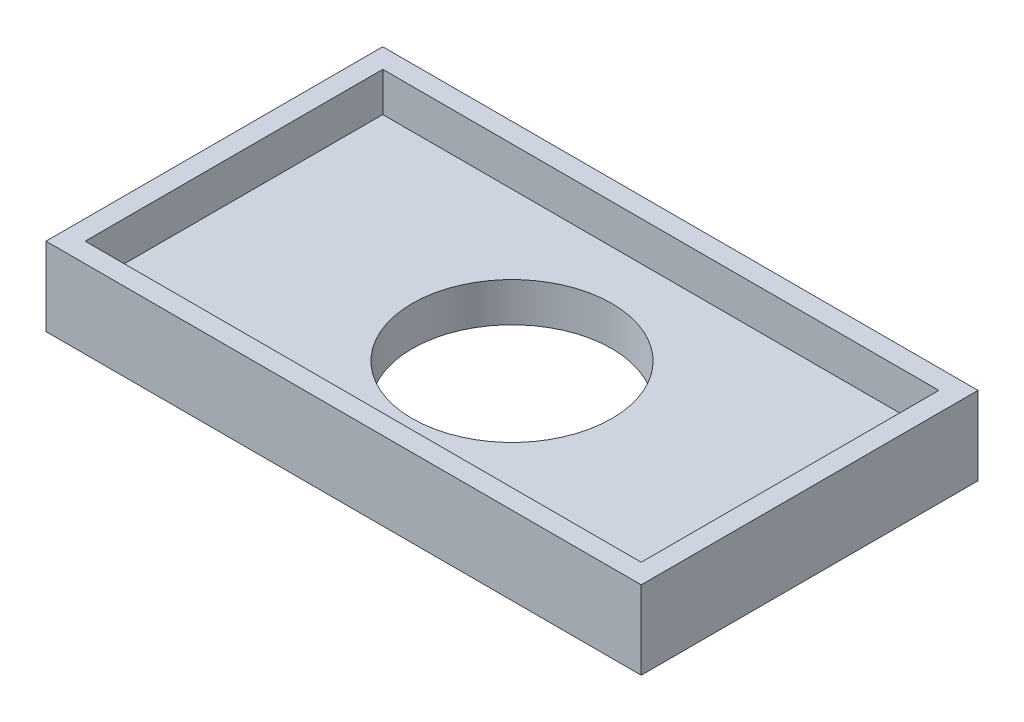
ISO-10303-21;
HEADER;
FILE_DESCRIPTION(('STEP AP214'),'2;1');
FILE_NAME('part.step','',(''),(''),'','','');
FILE_SCHEMA(('AUTOMOTIVE_DESIGN { 1 0 10303 214 1 1 1 1 }'));
ENDSEC;
DATA;
#1=APPLICATION_CONTEXT('core data for automotive mechanical design processes');
#2=APPLICATION_PROTOCOL_DEFINITION('international standard','automotive_design',2000,#1);
#3=PRODUCT_CONTEXT('',#1,'mechanical');
#4=PRODUCT('Part','Part','',(#3));
#5=PRODUCT_RELATED_PRODUCT_CATEGORY('part','',(#4));
#6=PRODUCT_DEFINITION_FORMATION('','',#4);
#7=PRODUCT_DEFINITION_CONTEXT('part definition',#1,'design');
#8=PRODUCT_DEFINITION('design','',#6,#7);
#9=PRODUCT_DEFINITION_SHAPE('','',#8);
#10=(LENGTH_UNIT() NAMED_UNIT(*) SI_UNIT(.MILLI.,.METRE.));
#11=(NAMED_UNIT(*) PLANE_ANGLE_UNIT() SI_UNIT($,.RADIAN.));
#12=(NAMED_UNIT(*) SI_UNIT($,.STERADIAN.) SOLID_ANGLE_UNIT());
#13=UNCERTAINTY_MEASURE_WITH_UNIT(LENGTH_MEASURE(1.E-05),#10,'distance_accuracy_value','');
#14=(GEOMETRIC_REPRESENTATION_CONTEXT(3) GLOBAL_UNCERTAINTY_ASSIGNED_CONTEXT((#13)) GLOBAL_UNIT_ASSIGNED_CONTEXT((#10,
#11,#12)) REPRESENTATION_CONTEXT('',''));
#15=CARTESIAN_POINT('',(0.,0.,0.));
#16=DIRECTION('',(0.,0.,1.));
#17=DIRECTION('',(1.,0.,0.));
#18=AXIS2_PLACEMENT_3D('',#15,#16,#17);
#19=CARTESIAN_POINT('',(76.,10.,-43.));
#20=DIRECTION('',(-1.,0.,0.));
#21=DIRECTION('',(0.,0.,1.));
#22=AXIS2_PLACEMENT_3D('',#19,#20,#21);
#23=PLANE('',#22);
#24=DIRECTION('',(0.,0.,-1.));
#25=VECTOR('',#24,1.);
#26=CARTESIAN_POINT('',(76.,0.,-43.));
#27=LINE('',#26,#25);
#28=CARTESIAN_POINT('',(76.,0.,43.));
#29=VERTEX_POINT('',#28);
#30=CARTESIAN_POINT('',(76.,0.,-43.));
#31=VERTEX_POINT('',#30);
#32=EDGE_CURVE('E150',#29,#31,#27,.T.);
#33=ORIENTED_EDGE('',*,*,#32,.T.);
#34=DIRECTION('',(0.,-1.,0.));
#35=VECTOR('',#34,1.);
#36=CARTESIAN_POINT('',(76.,10.,-43.));
#37=LINE('',#36,#35);
#38=CARTESIAN_POINT('',(76.,20.,-43.));
#39=VERTEX_POINT('',#38);
#40=EDGE_CURVE('E11',#39,#31,#37,.T.);
#41=ORIENTED_EDGE('',*,*,#40,.F.);
#42=DIRECTION('',(0.,0.,-1.));
#43=VECTOR('',#42,1.);
#44=CARTESIAN_POINT('',(76.,20.,-43.));
#45=LINE('',#44,#43);
#46=CARTESIAN_POINT('',(76.,20.,43.));
#47=VERTEX_POINT('',#46);
#48=EDGE_CURVE('E116',#47,#39,#45,.T.);
#49=ORIENTED_EDGE('',*,*,#48,.F.);
#50=DIRECTION('',(0.,-1.,0.));
#51=VECTOR('',#50,1.);
#52=CARTESIAN_POINT('',(76.,10.,43.));
#53=LINE('',#52,#51);
#54=EDGE_CURVE('E159',#47,#29,#53,.T.);
#55=ORIENTED_EDGE('',*,*,#54,.T.);
#56=EDGE_LOOP('',(#33,#41,#49,#55));
#57=FACE_BOUND('',#56,.T.);
#58=ADVANCED_FACE('F37',(#57),#23,.F.);
#59=CARTESIAN_POINT('',(-76.,10.,-43.));
#60=DIRECTION('',(0.,0.,1.));
#61=DIRECTION('',(1.,0.,0.));
#62=AXIS2_PLACEMENT_3D('',#59,#60,#61);
#63=PLANE('',#62);
#64=DIRECTION('',(-1.,0.,0.));
#65=VECTOR('',#64,1.);
#66=CARTESIAN_POINT('',(-76.,0.,-43.));
#67=LINE('',#66,#65);
#68=CARTESIAN_POINT('',(-76.,0.,-43.));
#69=VERTEX_POINT('',#68);
#70=EDGE_CURVE('E153',#31,#69,#67,.T.);
#71=ORIENTED_EDGE('',*,*,#70,.T.);
#72=DIRECTION('',(0.,-1.,0.));
#73=VECTOR('',#72,1.);
#74=CARTESIAN_POINT('',(-76.,10.,-43.));
#75=LINE('',#74,#73);
#76=CARTESIAN_POINT('',(-76.,20.,-43.));
#77=VERTEX_POINT('',#76);
#78=EDGE_CURVE('E45',#77,#69,#75,.T.);
#79=ORIENTED_EDGE('',*,*,#78,.F.);
#80=DIRECTION('',(-1.,0.,0.));
#81=VECTOR('',#80,1.);
#82=CARTESIAN_POINT('',(-76.,20.,-43.));
#83=LINE('',#82,#81);
#84=EDGE_CURVE('E141',#39,#77,#83,.T.);
#85=ORIENTED_EDGE('',*,*,#84,.F.);
#86=ORIENTED_EDGE('',*,*,#40,.T.);
#87=EDGE_LOOP('',(#71,#79,#85,#86));
#88=FACE_BOUND('',#87,.T.);
#89=ADVANCED_FACE('F182',(#88),#63,.F.);
#90=CARTESIAN_POINT('',(-76.,10.,-43.));
#91=DIRECTION('',(1.,0.,0.));
#92=DIRECTION('',(0.,0.,-1.));
#93=AXIS2_PLACEMENT_3D('',#90,#91,#92);
#94=PLANE('',#93);
#95=DIRECTION('',(0.,0.,1.));
#96=VECTOR('',#95,1.);
#97=CARTESIAN_POINT('',(-76.,0.,-43.));
#98=LINE('',#97,#96);
#99=CARTESIAN_POINT('',(-76.,0.,43.));
#100=VERTEX_POINT('',#99);
#101=EDGE_CURVE('E155',#69,#100,#98,.T.);
#102=ORIENTED_EDGE('',*,*,#101,.T.);
#103=DIRECTION('',(0.,-1.,0.));
#104=VECTOR('',#103,1.);
#105=CARTESIAN_POINT('',(-76.,10.,43.));
#106=LINE('',#105,#104);
#107=CARTESIAN_POINT('',(-76.,20.,43.));
#108=VERTEX_POINT('',#107);
#109=EDGE_CURVE('E162',#108,#100,#106,.T.);
#110=ORIENTED_EDGE('',*,*,#109,.F.);
#111=DIRECTION('',(0.,0.,1.));
#112=VECTOR('',#111,1.);
#113=CARTESIAN_POINT('',(-76.,20.,-43.));
#114=LINE('',#113,#112);
#115=EDGE_CURVE('E144',#77,#108,#114,.T.);
#116=ORIENTED_EDGE('',*,*,#115,.F.);
#117=ORIENTED_EDGE('',*,*,#78,.T.);
#118=EDGE_LOOP('',(#102,#110,#116,#117));
#119=FACE_BOUND('',#118,.T.);
#120=ADVANCED_FACE('F169',(#119),#94,.F.);
#121=CARTESIAN_POINT('',(-76.,10.,43.));
#122=DIRECTION('',(0.,0.,-1.));
#123=DIRECTION('',(-1.,0.,0.));
#124=AXIS2_PLACEMENT_3D('',#121,#122,#123);
#125=PLANE('',#124);
#126=DIRECTION('',(1.,0.,0.));
#127=VECTOR('',#126,1.);
#128=CARTESIAN_POINT('',(-76.,0.,43.));
#129=LINE('',#128,#127);
#130=EDGE_CURVE('E157',#100,#29,#129,.T.);
#131=ORIENTED_EDGE('',*,*,#130,.T.);
#132=ORIENTED_EDGE('',*,*,#54,.F.);
#133=DIRECTION('',(1.,0.,0.));
#134=VECTOR('',#133,1.);
#135=CARTESIAN_POINT('',(-76.,20.,43.));
#136=LINE('',#135,#134);
#137=EDGE_CURVE('E147',#108,#47,#136,.T.);
#138=ORIENTED_EDGE('',*,*,#137,.F.);
#139=ORIENTED_EDGE('',*,*,#109,.T.);
#140=EDGE_LOOP('',(#131,#132,#138,#139));
#141=FACE_BOUND('',#140,.T.);
#142=ADVANCED_FACE('F177',(#141),#125,.F.);
#143=CARTESIAN_POINT('',(0.,0.,0.));
#144=DIRECTION('',(0.,1.,0.));
#145=DIRECTION('',(0.,0.,1.));
#146=AXIS2_PLACEMENT_3D('',#143,#144,#145);
#147=PLANE('',#146);
#148=CARTESIAN_POINT('',(0.,0.,0.));
#149=DIRECTION('',(0.,-1.,0.));
#150=DIRECTION('',(0.,0.,-1.));
#151=AXIS2_PLACEMENT_3D('',#148,#149,#150);
#152=CIRCLE('',#151,25.4777875);
#153=CARTESIAN_POINT('',(0.,0.,-25.4777875));
#154=VERTEX_POINT('',#153);
#155=EDGE_CURVE('E223',#154,#154,#152,.T.);
#156=ORIENTED_EDGE('',*,*,#155,.F.);
#157=EDGE_LOOP('',(#156));
#158=FACE_BOUND('',#157,.T.);
#159=ORIENTED_EDGE('',*,*,#32,.F.);
#160=ORIENTED_EDGE('',*,*,#130,.F.);
#161=ORIENTED_EDGE('',*,*,#101,.F.);
#162=ORIENTED_EDGE('',*,*,#70,.F.);
#163=EDGE_LOOP('',(#159,#160,#161,#162));
#164=FACE_BOUND('',#163,.T.);
#165=ADVANCED_FACE('F175',(#158,#164),#147,.F.);
#166=CARTESIAN_POINT('',(0.,20.,0.));
#167=DIRECTION('',(0.,1.,0.));
#168=DIRECTION('',(0.,0.,1.));
#169=AXIS2_PLACEMENT_3D('',#166,#167,#168);
#170=PLANE('',#169);
#171=ORIENTED_EDGE('',*,*,#48,.T.);
#172=ORIENTED_EDGE('',*,*,#84,.T.);
#173=ORIENTED_EDGE('',*,*,#115,.T.);
#174=ORIENTED_EDGE('',*,*,#137,.T.);
#175=EDGE_LOOP('',(#171,#172,#173,#174));
#176=FACE_BOUND('',#175,.T.);
#177=DIRECTION('',(-1.,0.,0.));
#178=VECTOR('',#177,1.);
#179=CARTESIAN_POINT('',(-71.,20.,-38.));
#180=LINE('',#179,#178);
#181=CARTESIAN_POINT('',(71.,20.,-38.));
#182=VERTEX_POINT('',#181);
#183=CARTESIAN_POINT('',(-71.,20.,-38.));
#184=VERTEX_POINT('',#183);
#185=EDGE_CURVE('E110',#182,#184,#180,.T.);
#186=ORIENTED_EDGE('',*,*,#185,.F.);
#187=DIRECTION('',(0.,0.,-1.));
#188=VECTOR('',#187,1.);
#189=CARTESIAN_POINT('',(71.,20.,-38.));
#190=LINE('',#189,#188);
#191=CARTESIAN_POINT('',(71.,20.,38.));
#192=VERTEX_POINT('',#191);
#193=EDGE_CURVE('E101',#192,#182,#190,.T.);
#194=ORIENTED_EDGE('',*,*,#193,.F.);
#195=DIRECTION('',(1.,0.,0.));
#196=VECTOR('',#195,1.);
#197=CARTESIAN_POINT('',(-71.,20.,38.));
#198=LINE('',#197,#196);
#199=CARTESIAN_POINT('',(-71.,20.,38.));
#200=VERTEX_POINT('',#199);
#201=EDGE_CURVE('E124',#200,#192,#198,.T.);
#202=ORIENTED_EDGE('',*,*,#201,.F.);
#203=DIRECTION('',(0.,0.,1.));
#204=VECTOR('',#203,1.);
#205=CARTESIAN_POINT('',(-71.,20.,-38.));
#206=LINE('',#205,#204);
#207=EDGE_CURVE('E122',#184,#200,#206,.T.);
#208=ORIENTED_EDGE('',*,*,#207,.F.);
#209=EDGE_LOOP('',(#186,#194,#202,#208));
#210=FACE_BOUND('',#209,.T.);
#211=ADVANCED_FACE('F120',(#176,#210),#170,.T.);
#212=CARTESIAN_POINT('',(71.,20.,-38.));
#213=DIRECTION('',(-1.,0.,0.));
#214=DIRECTION('',(0.,0.,1.));
#215=AXIS2_PLACEMENT_3D('',#212,#213,#214);
#216=PLANE('',#215);
#217=DIRECTION('',(0.,0.,-1.));
#218=VECTOR('',#217,1.);
#219=CARTESIAN_POINT('',(71.,10.,-38.));
#220=LINE('',#219,#218);
#221=CARTESIAN_POINT('',(71.,10.,38.));
#222=VERTEX_POINT('',#221);
#223=CARTESIAN_POINT('',(71.,10.,-38.));
#224=VERTEX_POINT('',#223);
#225=EDGE_CURVE('E52',#222,#224,#220,.T.);
#226=ORIENTED_EDGE('',*,*,#225,.F.);
#227=DIRECTION('',(0.,-1.,0.));
#228=VECTOR('',#227,1.);
#229=CARTESIAN_POINT('',(71.,20.,38.));
#230=LINE('',#229,#228);
#231=EDGE_CURVE('E106',#192,#222,#230,.T.);
#232=ORIENTED_EDGE('',*,*,#231,.F.);
#233=ORIENTED_EDGE('',*,*,#193,.T.);
#234=DIRECTION('',(0.,-1.,0.));
#235=VECTOR('',#234,1.);
#236=CARTESIAN_POINT('',(71.,20.,-38.));
#237=LINE('',#236,#235);
#238=EDGE_CURVE('E104',#182,#224,#237,.T.);
#239=ORIENTED_EDGE('',*,*,#238,.T.);
#240=EDGE_LOOP('',(#226,#232,#233,#239));
#241=FACE_BOUND('',#240,.T.);
#242=ADVANCED_FACE('F103',(#241),#216,.T.);
#243=CARTESIAN_POINT('',(-71.,20.,-38.));
#244=DIRECTION('',(0.,0.,1.));
#245=DIRECTION('',(1.,0.,0.));
#246=AXIS2_PLACEMENT_3D('',#243,#244,#245);
#247=PLANE('',#246);
#248=DIRECTION('',(-1.,0.,0.));
#249=VECTOR('',#248,1.);
#250=CARTESIAN_POINT('',(-71.,10.,-38.));
#251=LINE('',#250,#249);
#252=CARTESIAN_POINT('',(-71.,10.,-38.));
#253=VERTEX_POINT('',#252);
#254=EDGE_CURVE('E56',#224,#253,#251,.T.);
#255=ORIENTED_EDGE('',*,*,#254,.F.);
#256=ORIENTED_EDGE('',*,*,#238,.F.);
#257=ORIENTED_EDGE('',*,*,#185,.T.);
#258=DIRECTION('',(0.,-1.,0.));
#259=VECTOR('',#258,1.);
#260=CARTESIAN_POINT('',(-71.,20.,-38.));
#261=LINE('',#260,#259);
#262=EDGE_CURVE('E117',#184,#253,#261,.T.);
#263=ORIENTED_EDGE('',*,*,#262,.T.);
#264=EDGE_LOOP('',(#255,#256,#257,#263));
#265=FACE_BOUND('',#264,.T.);
#266=ADVANCED_FACE('F114',(#265),#247,.T.);
#267=CARTESIAN_POINT('',(-71.,20.,-38.));
#268=DIRECTION('',(1.,0.,0.));
#269=DIRECTION('',(0.,0.,-1.));
#270=AXIS2_PLACEMENT_3D('',#267,#268,#269);
#271=PLANE('',#270);
#272=DIRECTION('',(0.,0.,1.));
#273=VECTOR('',#272,1.);
#274=CARTESIAN_POINT('',(-71.,10.,-38.));
#275=LINE('',#274,#273);
#276=CARTESIAN_POINT('',(-71.,10.,38.));
#277=VERTEX_POINT('',#276);
#278=EDGE_CURVE('E131',#253,#277,#275,.T.);
#279=ORIENTED_EDGE('',*,*,#278,.F.);
#280=ORIENTED_EDGE('',*,*,#262,.F.);
#281=ORIENTED_EDGE('',*,*,#207,.T.);
#282=DIRECTION('',(0.,-1.,0.));
#283=VECTOR('',#282,1.);
#284=CARTESIAN_POINT('',(-71.,20.,38.));
#285=LINE('',#284,#283);
#286=EDGE_CURVE('E135',#200,#277,#285,.T.);
#287=ORIENTED_EDGE('',*,*,#286,.T.);
#288=EDGE_LOOP('',(#279,#280,#281,#287));
#289=FACE_BOUND('',#288,.T.);
#290=ADVANCED_FACE('F207',(#289),#271,.T.);
#291=CARTESIAN_POINT('',(-71.,20.,38.));
#292=DIRECTION('',(0.,0.,-1.));
#293=DIRECTION('',(-1.,0.,0.));
#294=AXIS2_PLACEMENT_3D('',#291,#292,#293);
#295=PLANE('',#294);
#296=DIRECTION('',(1.,0.,0.));
#297=VECTOR('',#296,1.);
#298=CARTESIAN_POINT('',(-71.,10.,38.));
#299=LINE('',#298,#297);
#300=EDGE_CURVE('E111',#277,#222,#299,.T.);
#301=ORIENTED_EDGE('',*,*,#300,.F.);
#302=ORIENTED_EDGE('',*,*,#286,.F.);
#303=ORIENTED_EDGE('',*,*,#201,.T.);
#304=ORIENTED_EDGE('',*,*,#231,.T.);
#305=EDGE_LOOP('',(#301,#302,#303,#304));
#306=FACE_BOUND('',#305,.T.);
#307=ADVANCED_FACE('F199',(#306),#295,.T.);
#308=CARTESIAN_POINT('',(0.,10.,0.));
#309=DIRECTION('',(0.,1.,0.));
#310=DIRECTION('',(0.,0.,1.));
#311=AXIS2_PLACEMENT_3D('',#308,#309,#310);
#312=PLANE('',#311);
#313=CARTESIAN_POINT('',(0.,10.,0.));
#314=DIRECTION('',(0.,1.,0.));
#315=DIRECTION('',(0.,0.,1.));
#316=AXIS2_PLACEMENT_3D('',#313,#314,#315);
#317=CIRCLE('',#316,25.4777875);
#318=CARTESIAN_POINT('',(0.,10.,25.4777875));
#319=VERTEX_POINT('',#318);
#320=EDGE_CURVE('E40',#319,#319,#317,.T.);
#321=ORIENTED_EDGE('',*,*,#320,.F.);
#322=EDGE_LOOP('',(#321));
#323=FACE_BOUND('',#322,.T.);
#324=ORIENTED_EDGE('',*,*,#225,.T.);
#325=ORIENTED_EDGE('',*,*,#254,.T.);
#326=ORIENTED_EDGE('',*,*,#278,.T.);
#327=ORIENTED_EDGE('',*,*,#300,.T.);
#328=EDGE_LOOP('',(#324,#325,#326,#327));
#329=FACE_BOUND('',#328,.T.);
#330=ADVANCED_FACE('F195',(#323,#329),#312,.T.);
#331=CARTESIAN_POINT('',(0.,0.,0.));
#332=DIRECTION('',(0.,-1.,0.));
#333=DIRECTION('',(0.,0.,-1.));
#334=AXIS2_PLACEMENT_3D('',#331,#332,#333);
#335=CYLINDRICAL_SURFACE('',#334,25.4777875);
#336=ORIENTED_EDGE('',*,*,#320,.T.);
#337=EDGE_LOOP('',(#336));
#338=FACE_BOUND('',#337,.T.);
#339=ORIENTED_EDGE('',*,*,#155,.T.);
#340=EDGE_LOOP('',(#339));
#341=FACE_BOUND('',#340,.T.);
#342=ADVANCED_FACE('F198',(#338,#341),#335,.F.);
#343=CLOSED_SHELL('',(#58,#89,#120,#142,#165,#211,#242,#266,#290,#307,#330,#342));
#344=MANIFOLD_SOLID_BREP('B2',#343);
#345=ADVANCED_BREP_SHAPE_REPRESENTATION('',(#18,#344),#14);
#346=SHAPE_DEFINITION_REPRESENTATION(#9,#345);
ENDSEC;
END-ISO-10303-21;
